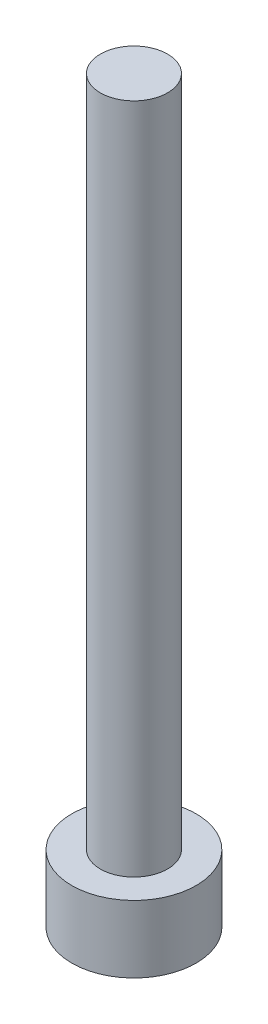
ISO-10303-21;
HEADER;
FILE_DESCRIPTION(('STEP AP214'),'2;1');
FILE_NAME('part.step','',(''),(''),'','','');
FILE_SCHEMA(('AUTOMOTIVE_DESIGN { 1 0 10303 214 1 1 1 1 }'));
ENDSEC;
DATA;
#1=APPLICATION_CONTEXT('core data for automotive mechanical design processes');
#2=APPLICATION_PROTOCOL_DEFINITION('international standard','automotive_design',2000,#1);
#3=PRODUCT_CONTEXT('',#1,'mechanical');
#4=PRODUCT('Part','Part','',(#3));
#5=PRODUCT_RELATED_PRODUCT_CATEGORY('part','',(#4));
#6=PRODUCT_DEFINITION_FORMATION('','',#4);
#7=PRODUCT_DEFINITION_CONTEXT('part definition',#1,'design');
#8=PRODUCT_DEFINITION('design','',#6,#7);
#9=PRODUCT_DEFINITION_SHAPE('','',#8);
#10=(LENGTH_UNIT() NAMED_UNIT(*) SI_UNIT(.MILLI.,.METRE.));
#11=(NAMED_UNIT(*) PLANE_ANGLE_UNIT() SI_UNIT($,.RADIAN.));
#12=(NAMED_UNIT(*) SI_UNIT($,.STERADIAN.) SOLID_ANGLE_UNIT());
#13=UNCERTAINTY_MEASURE_WITH_UNIT(LENGTH_MEASURE(1.E-05),#10,'distance_accuracy_value','');
#14=(GEOMETRIC_REPRESENTATION_CONTEXT(3) GLOBAL_UNCERTAINTY_ASSIGNED_CONTEXT((#13)) GLOBAL_UNIT_ASSIGNED_CONTEXT((#10,
#11,#12)) REPRESENTATION_CONTEXT('',''));
#15=CARTESIAN_POINT('',(0.,0.,0.));
#16=DIRECTION('',(0.,0.,1.));
#17=DIRECTION('',(1.,0.,0.));
#18=AXIS2_PLACEMENT_3D('',#15,#16,#17);
#19=CARTESIAN_POINT('',(0.,2.,0.));
#20=DIRECTION('',(0.,-1.,0.));
#21=DIRECTION('',(0.,0.,-1.));
#22=AXIS2_PLACEMENT_3D('',#19,#20,#21);
#23=CYLINDRICAL_SURFACE('',#22,1.85);
#24=CARTESIAN_POINT('',(0.,2.,0.));
#25=DIRECTION('',(0.,1.,0.));
#26=DIRECTION('',(0.,0.,1.));
#27=AXIS2_PLACEMENT_3D('',#24,#25,#26);
#28=CIRCLE('',#27,1.85);
#29=CARTESIAN_POINT('',(0.,2.,1.85));
#30=VERTEX_POINT('',#29);
#31=EDGE_CURVE('E10',#30,#30,#28,.T.);
#32=ORIENTED_EDGE('',*,*,#31,.F.);
#33=EDGE_LOOP('',(#32));
#34=FACE_BOUND('',#33,.T.);
#35=CARTESIAN_POINT('',(0.,0.,0.));
#36=DIRECTION('',(0.,1.,0.));
#37=DIRECTION('',(0.,0.,1.));
#38=AXIS2_PLACEMENT_3D('',#35,#36,#37);
#39=CIRCLE('',#38,1.85);
#40=CARTESIAN_POINT('',(0.,0.,1.85));
#41=VERTEX_POINT('',#40);
#42=EDGE_CURVE('E34',#41,#41,#39,.T.);
#43=ORIENTED_EDGE('',*,*,#42,.T.);
#44=EDGE_LOOP('',(#43));
#45=FACE_BOUND('',#44,.T.);
#46=ADVANCED_FACE('F31',(#34,#45),#23,.T.);
#47=CARTESIAN_POINT('',(0.,2.,0.));
#48=DIRECTION('',(0.,1.,0.));
#49=DIRECTION('',(0.,0.,1.));
#50=AXIS2_PLACEMENT_3D('',#47,#48,#49);
#51=PLANE('',#50);
#52=CARTESIAN_POINT('',(0.,2.,0.));
#53=DIRECTION('',(0.,1.,0.));
#54=DIRECTION('',(0.,0.,1.));
#55=AXIS2_PLACEMENT_3D('',#52,#53,#54);
#56=CIRCLE('',#55,1.);
#57=CARTESIAN_POINT('',(0.,2.,1.));
#58=VERTEX_POINT('',#57);
#59=EDGE_CURVE('E43',#58,#58,#56,.T.);
#60=ORIENTED_EDGE('',*,*,#59,.F.);
#61=EDGE_LOOP('',(#60));
#62=FACE_BOUND('',#61,.T.);
#63=ORIENTED_EDGE('',*,*,#31,.T.);
#64=EDGE_LOOP('',(#63));
#65=FACE_BOUND('',#64,.T.);
#66=ADVANCED_FACE('F58',(#62,#65),#51,.T.);
#67=CARTESIAN_POINT('',(0.,0.,0.));
#68=DIRECTION('',(0.,1.,0.));
#69=DIRECTION('',(0.,0.,1.));
#70=AXIS2_PLACEMENT_3D('',#67,#68,#69);
#71=PLANE('',#70);
#72=ORIENTED_EDGE('',*,*,#42,.F.);
#73=EDGE_LOOP('',(#72));
#74=FACE_BOUND('',#73,.T.);
#75=ADVANCED_FACE('F54',(#74),#71,.F.);
#76=CARTESIAN_POINT('',(0.,22.,0.));
#77=DIRECTION('',(0.,-1.,0.));
#78=DIRECTION('',(0.,0.,-1.));
#79=AXIS2_PLACEMENT_3D('',#76,#77,#78);
#80=CYLINDRICAL_SURFACE('',#79,1.);
#81=CARTESIAN_POINT('',(0.,22.,0.));
#82=DIRECTION('',(0.,1.,0.));
#83=DIRECTION('',(0.,0.,1.));
#84=AXIS2_PLACEMENT_3D('',#81,#82,#83);
#85=CIRCLE('',#84,1.);
#86=CARTESIAN_POINT('',(0.,22.,1.));
#87=VERTEX_POINT('',#86);
#88=EDGE_CURVE('E41',#87,#87,#85,.T.);
#89=ORIENTED_EDGE('',*,*,#88,.F.);
#90=EDGE_LOOP('',(#89));
#91=FACE_BOUND('',#90,.T.);
#92=ORIENTED_EDGE('',*,*,#59,.T.);
#93=EDGE_LOOP('',(#92));
#94=FACE_BOUND('',#93,.T.);
#95=ADVANCED_FACE('F51',(#91,#94),#80,.T.);
#96=CARTESIAN_POINT('',(0.,22.,0.));
#97=DIRECTION('',(0.,1.,0.));
#98=DIRECTION('',(0.,0.,1.));
#99=AXIS2_PLACEMENT_3D('',#96,#97,#98);
#100=PLANE('',#99);
#101=ORIENTED_EDGE('',*,*,#88,.T.);
#102=EDGE_LOOP('',(#101));
#103=FACE_BOUND('',#102,.T.);
#104=ADVANCED_FACE('F49',(#103),#100,.T.);
#105=CLOSED_SHELL('',(#46,#66,#75,#95,#104));
#106=MANIFOLD_SOLID_BREP('B2',#105);
#107=ADVANCED_BREP_SHAPE_REPRESENTATION('',(#18,#106),#14);
#108=SHAPE_DEFINITION_REPRESENTATION(#9,#107);
ENDSEC;
END-ISO-10303-21;
